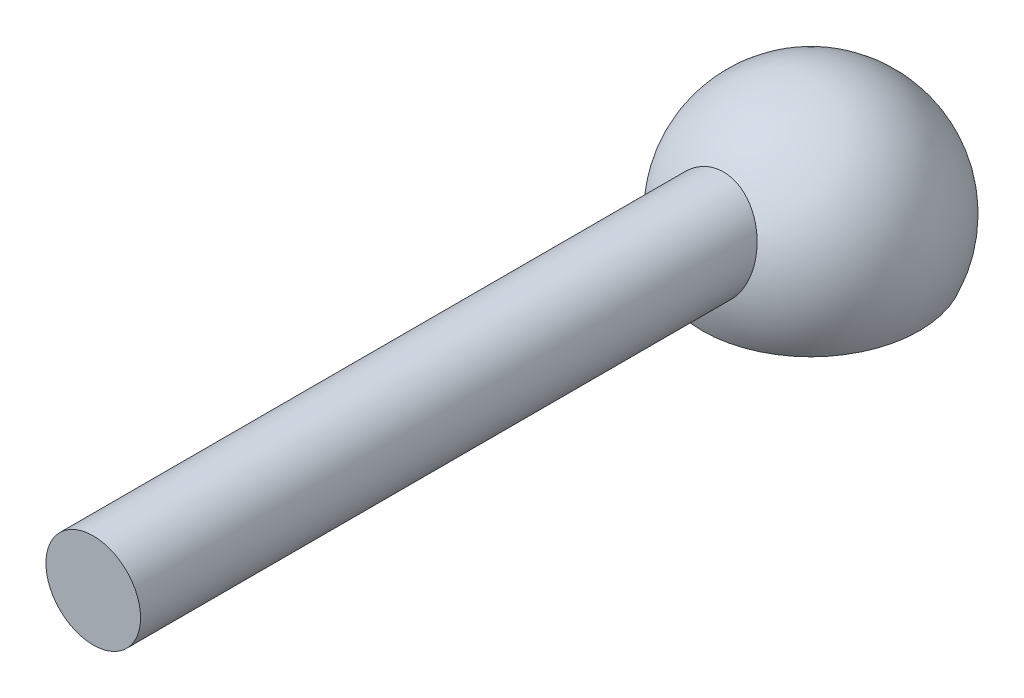
ISO-10303-21;
HEADER;
FILE_DESCRIPTION(('STEP AP214'),'2;1');
FILE_NAME('part.step','',(''),(''),'','','');
FILE_SCHEMA(('AUTOMOTIVE_DESIGN { 1 0 10303 214 1 1 1 1 }'));
ENDSEC;
DATA;
#1=APPLICATION_CONTEXT('core data for automotive mechanical design processes');
#2=APPLICATION_PROTOCOL_DEFINITION('international standard','automotive_design',2000,#1);
#3=PRODUCT_CONTEXT('',#1,'mechanical');
#4=PRODUCT('Part','Part','',(#3));
#5=PRODUCT_RELATED_PRODUCT_CATEGORY('part','',(#4));
#6=PRODUCT_DEFINITION_FORMATION('','',#4);
#7=PRODUCT_DEFINITION_CONTEXT('part definition',#1,'design');
#8=PRODUCT_DEFINITION('design','',#6,#7);
#9=PRODUCT_DEFINITION_SHAPE('','',#8);
#10=(LENGTH_UNIT() NAMED_UNIT(*) SI_UNIT(.MILLI.,.METRE.));
#11=(NAMED_UNIT(*) PLANE_ANGLE_UNIT() SI_UNIT($,.RADIAN.));
#12=(NAMED_UNIT(*) SI_UNIT($,.STERADIAN.) SOLID_ANGLE_UNIT());
#13=UNCERTAINTY_MEASURE_WITH_UNIT(LENGTH_MEASURE(1.E-05),#10,'distance_accuracy_value','');
#14=(GEOMETRIC_REPRESENTATION_CONTEXT(3) GLOBAL_UNCERTAINTY_ASSIGNED_CONTEXT((#13)) GLOBAL_UNIT_ASSIGNED_CONTEXT((#10,
#11,#12)) REPRESENTATION_CONTEXT('',''));
#15=CARTESIAN_POINT('',(0.,0.,0.));
#16=DIRECTION('',(0.,0.,1.));
#17=DIRECTION('',(1.,0.,0.));
#18=AXIS2_PLACEMENT_3D('',#15,#16,#17);
#19=CARTESIAN_POINT('',(37.3125835070615,6.,0.));
#20=DIRECTION('',(0.,1.,0.));
#21=DIRECTION('',(1.,0.,0.));
#22=AXIS2_PLACEMENT_3D('',#19,#20,#21);
#23=SPHERICAL_SURFACE('',#22,9.99999999999999);
#24=CARTESIAN_POINT('',(37.3125835070615,0.,0.));
#25=DIRECTION('',(0.,1.,0.));
#26=DIRECTION('',(0.,0.,1.));
#27=AXIS2_PLACEMENT_3D('',#24,#25,#26);
#28=CIRCLE('',#27,7.99999999999999);
#29=CARTESIAN_POINT('',(37.3125835070615,0.,7.99999999999999));
#30=VERTEX_POINT('',#29);
#31=EDGE_CURVE('E67',#30,#30,#28,.T.);
#32=ORIENTED_EDGE('',*,*,#31,.F.);
#33=EDGE_LOOP('',(#32));
#34=FACE_BOUND('',#33,.T.);
#35=CARTESIAN_POINT('',(39.1906681265482,15.822056715477,-0.000200000000000014));
#36=CARTESIAN_POINT('',(39.1906230974546,15.8220664757265,0.0446535123547709));
#37=CARTESIAN_POINT('',(39.1928766198065,15.8213289773038,0.0894635745935209));
#38=CARTESIAN_POINT('',(39.201642595824,15.8184312090794,0.1784987705083));
#39=CARTESIAN_POINT('',(39.208143297055,15.81627486527,0.222725175709271));
#40=CARTESIAN_POINT('',(39.2331615737999,15.8079020767784,0.352241360086195));
#41=CARTESIAN_POINT('',(39.2572259417548,15.7997749534268,0.436355595791474));
#42=CARTESIAN_POINT('',(39.3099033092538,15.781419650405,0.582508896572899));
#43=CARTESIAN_POINT('',(39.3364681770693,15.7720030147226,0.645445372399491));
#44=CARTESIAN_POINT('',(39.3944908936401,15.7508757363857,0.768653954140613));
#45=CARTESIAN_POINT('',(39.4259521103028,15.7391635132839,0.82892418918419));
#46=CARTESIAN_POINT('',(39.4927634330388,15.7135668387694,0.947792933402546));
#47=CARTESIAN_POINT('',(39.5281577863427,15.6996567299441,1.00636056037064));
#48=CARTESIAN_POINT('',(39.601440010752,15.6699793317295,1.12138524258195));
#49=CARTESIAN_POINT('',(39.6393271772049,15.6542125661815,1.17784288724599));
#50=CARTESIAN_POINT('',(39.7419392599826,15.6101896797294,1.32502842520843));
#51=CARTESIAN_POINT('',(39.8081545720566,15.58045794944,1.41427151258886));
#52=CARTESIAN_POINT('',(39.9430874857864,15.516713132872,1.58929491891902));
#53=CARTESIAN_POINT('',(40.0118063712368,15.4826978274393,1.67507341235454));
#54=CARTESIAN_POINT('',(40.1504787004132,15.4105751246969,1.84409705731475));
#55=CARTESIAN_POINT('',(40.2204338298428,15.3724617104362,1.92733824704162));
#56=CARTESIAN_POINT('',(40.3605749106433,15.2923448393309,2.0917345077868));
#57=CARTESIAN_POINT('',(40.4307608921926,15.2503408526718,2.1728892927523));
#58=CARTESIAN_POINT('',(40.6404200101803,15.1188271277259,2.41358361635266));
#59=CARTESIAN_POINT('',(40.7792446720571,15.0236871425457,2.57064871808993));
#60=CARTESIAN_POINT('',(41.0514698697103,14.8192813985914,2.87990707643909));
#61=CARTESIAN_POINT('',(41.1848744824165,14.7100265255835,3.03210397584051));
#62=CARTESIAN_POINT('',(41.454125366885,14.4689954981761,3.34441572630844));
#63=CARTESIAN_POINT('',(41.5893533438659,14.3361282557736,3.50422469994522));
#64=CARTESIAN_POINT('',(41.8485813505707,14.055641298096,3.82005114898483));
#65=CARTESIAN_POINT('',(41.9725788704273,13.9080183005243,3.97606777117235));
#66=CARTESIAN_POINT('',(42.2073718921931,13.5990106081316,4.28457154747255));
#67=CARTESIAN_POINT('',(42.3181613552347,13.4376196758739,4.43705706164657));
#68=CARTESIAN_POINT('',(42.524664525927,13.1023211930525,4.7384302177279));
#69=CARTESIAN_POINT('',(42.620378801738,12.928414114563,4.88731799504917));
#70=CARTESIAN_POINT('',(42.802507653559,12.5541298121632,5.19388757075186));
#71=CARTESIAN_POINT('',(42.8874412114426,12.3527589847484,5.3512417873534));
#72=CARTESIAN_POINT('',(43.0356549446197,11.9387264434693,5.66130483345647));
#73=CARTESIAN_POINT('',(43.0989328912142,11.7260635700779,5.8140131833535));
#74=CARTESIAN_POINT('',(43.2020003720419,11.2917147122663,6.11431629844855));
#75=CARTESIAN_POINT('',(43.2417981471291,11.0700319228082,6.26191284060152));
#76=CARTESIAN_POINT('',(43.2962992439098,10.6200446239578,6.55153737241449));
#77=CARTESIAN_POINT('',(43.3110066524723,10.3917411991368,6.69356626528353));
#78=CARTESIAN_POINT('',(43.3137606875655,9.95651823122967,6.95623308313413));
#79=CARTESIAN_POINT('',(43.304554135628,9.74999922757624,7.07750877382257));
#80=CARTESIAN_POINT('',(43.264307479107,9.336029850253,7.31472354815865));
#81=CARTESIAN_POINT('',(43.2332706576267,9.12857962129308,7.43066343147718));
#82=CARTESIAN_POINT('',(43.1487550784741,8.71516425821794,7.65664681497115));
#83=CARTESIAN_POINT('',(43.0952878911164,8.50919841404611,7.76669332218684));
#84=CARTESIAN_POINT('',(42.9655231467517,8.10117019348611,7.98038726680369));
#85=CARTESIAN_POINT('',(42.8892290365534,7.89910723267253,8.08403566745476));
#86=CARTESIAN_POINT('',(42.7247247205798,7.5264787703458,8.27178347033333));
#87=CARTESIAN_POINT('',(42.6392033250849,7.35513774894399,8.35670550739188));
#88=CARTESIAN_POINT('',(42.4507866769231,7.01938976942338,8.52076761247005));
#89=CARTESIAN_POINT('',(42.3478943315203,6.85498165673333,8.599908644849));
#90=CARTESIAN_POINT('',(42.1251845084437,6.53513664621503,8.7519271020705));
#91=CARTESIAN_POINT('',(42.0053782523397,6.37969389583908,8.8248086286449));
#92=CARTESIAN_POINT('',(41.749430965538,6.07965035942451,8.96391353164725));
#93=CARTESIAN_POINT('',(41.6132919629956,5.93504823084348,9.03013773289026));
#94=CARTESIAN_POINT('',(41.3426367512337,5.67501432348808,9.14806258705098));
#95=CARTESIAN_POINT('',(41.2098332804627,5.5581552949783,9.20055459535112));
#96=CARTESIAN_POINT('',(40.9330811914325,5.33571637318087,9.2997144104518));
#97=CARTESIAN_POINT('',(40.7891340281994,5.23013501164392,9.34638297554489));
#98=CARTESIAN_POINT('',(40.4911655350889,5.03154673245012,9.43359200844422));
#99=CARTESIAN_POINT('',(40.337149025433,4.93853386268278,9.47413537806504));
#100=CARTESIAN_POINT('',(40.0201736491554,4.76618864622254,9.54885315499242));
#101=CARTESIAN_POINT('',(39.8572154630719,4.68685526030212,9.58302804612688));
#102=CARTESIAN_POINT('',(39.5392700752824,4.54960869300935,9.64189538811669));
#103=CARTESIAN_POINT('',(39.3849540877833,4.49038866759011,9.66717455863374));
#104=CARTESIAN_POINT('',(39.0712297649009,4.38470231598818,9.71215085870743));
#105=CARTESIAN_POINT('',(38.9118218531629,4.33823493186237,9.73184845130918));
#106=CARTESIAN_POINT('',(38.5891808081287,4.25859336409192,9.76553577542518));
#107=CARTESIAN_POINT('',(38.425948877588,4.22541505855266,9.77952727683133));
#108=CARTESIAN_POINT('',(38.0969060779758,4.17271750428558,9.80172220947066));
#109=CARTESIAN_POINT('',(37.9310952824912,4.15319786654157,9.80992580555078));
#110=CARTESIAN_POINT('',(37.6074242437401,4.12873966569827,9.82020111817497));
#111=CARTESIAN_POINT('',(37.4496296747648,4.12305653019387,9.82258597046778));
#112=CARTESIAN_POINT('',(37.1340363746771,4.12414693053182,9.82212822469511));
#113=CARTESIAN_POINT('',(36.9762376594219,4.1309245835427,9.81928389885716));
#114=CARTESIAN_POINT('',(36.6619226049077,4.15686692743106,9.80838345656097));
#115=CARTESIAN_POINT('',(36.5054056777232,4.17602557506163,9.80032988277002));
#116=CARTESIAN_POINT('',(36.1946484478341,4.22653182086151,9.77905588603804));
#117=CARTESIAN_POINT('',(36.0404090098765,4.25788393124937,9.76583355037567));
#118=CARTESIAN_POINT('',(35.7372634794439,4.33198484776759,9.73449423758246));
#119=CARTESIAN_POINT('',(35.588314860316,4.3745866273539,9.71644036750145));
#120=CARTESIAN_POINT('',(35.2947051379133,4.47095150914896,9.67545758163242));
#121=CARTESIAN_POINT('',(35.1500455908493,4.52471860719972,9.65252692046822));
#122=CARTESIAN_POINT('',(34.8660463440678,4.64286314765722,9.60192279385231));
#123=CARTESIAN_POINT('',(34.7267049093458,4.70723709255907,9.57425089165936));
#124=CARTESIAN_POINT('',(34.4540898418083,4.84602670408118,9.51428736091477));
#125=CARTESIAN_POINT('',(34.3208185125432,4.92044614110427,9.48199399750187));
#126=CARTESIAN_POINT('',(34.0575005682923,5.0808615675557,9.41197697881226));
#127=CARTESIAN_POINT('',(33.9276505491764,5.1671246118691,9.37412597913123));
#128=CARTESIAN_POINT('',(33.6759109052525,5.34876588103842,9.29388072598853));
#129=CARTESIAN_POINT('',(33.5540241978506,5.44414741533274,9.25148482232991));
#130=CARTESIAN_POINT('',(33.3189062570158,5.64313557472865,9.16236257550585));
#131=CARTESIAN_POINT('',(33.2056732092479,5.74674046637534,9.11563714464378));
#132=CARTESIAN_POINT('',(32.9883103324273,5.96135467699995,9.01803145323914));
#133=CARTESIAN_POINT('',(32.8841839447148,6.07236676740587,8.96714963595593));
#134=CARTESIAN_POINT('',(32.6792810632971,6.30802197079657,8.85814025884441));
#135=CARTESIAN_POINT('',(32.5791198560036,6.43308339382077,8.79975864202489));
#136=CARTESIAN_POINT('',(32.3899418203289,6.68946903591247,8.67878551306934));
#137=CARTESIAN_POINT('',(32.3009291571837,6.82079557054976,8.61619244082698));
#138=CARTESIAN_POINT('',(32.0510843597149,7.22254817174418,8.4224656471122));
#139=CARTESIAN_POINT('',(31.907310474447,7.50090417515854,8.28531240054269));
#140=CARTESIAN_POINT('',(31.6558005735178,8.09523912761075,7.98427922944451));
#141=CARTESIAN_POINT('',(31.5523826568632,8.41236704646864,7.81910810610715));
#142=CARTESIAN_POINT('',(31.3999258082357,9.051893247954,7.47423138067091));
#143=CARTESIAN_POINT('',(31.3509068544508,9.37429342275474,7.29452046476692));
#144=CARTESIAN_POINT('',(31.3152345101285,9.87174179876929,7.00596987191421));
#145=CARTESIAN_POINT('',(31.3104934515549,10.0482022043766,6.90138134410098));
#146=CARTESIAN_POINT('',(31.3163374873073,10.3987579738638,6.68864423235293));
#147=CARTESIAN_POINT('',(31.3269232821444,10.5728532292779,6.58049548591974));
#148=CARTESIAN_POINT('',(31.3628111240285,10.9174391442339,6.36090316862071));
#149=CARTESIAN_POINT('',(31.3881163617266,11.0879290139501,6.24945888837332));
#150=CARTESIAN_POINT('',(31.4527419371086,11.4241680474747,6.02351481303277));
#151=CARTESIAN_POINT('',(31.4920633499419,11.5899168465521,5.90901478416348));
#152=CARTESIAN_POINT('',(31.5890639862469,11.9337221089364,5.6642911514055));
#153=CARTESIAN_POINT('',(31.6482962369284,12.111103067633,5.53373277351038));
#154=CARTESIAN_POINT('',(31.7819797647897,12.457419055925,5.26935321388252));
#155=CARTESIAN_POINT('',(31.8564281785794,12.6263556671515,5.13553265019737));
#156=CARTESIAN_POINT('',(32.0194237011682,12.9548386621501,4.86463658710411));
#157=CARTESIAN_POINT('',(32.1079841736655,13.1143759469065,4.72755810829886));
#158=CARTESIAN_POINT('',(32.2978548713744,13.4228539892755,4.45036549380329));
#159=CARTESIAN_POINT('',(32.3991651534441,13.5717946996277,4.31025134457761));
#160=CARTESIAN_POINT('',(32.6250788793025,13.8741335879133,4.01118011910974));
#161=CARTESIAN_POINT('',(32.7510199685738,14.0261782186175,3.85186351059497));
#162=CARTESIAN_POINT('',(33.0148221492208,14.3149242212551,3.52924301093224));
#163=CARTESIAN_POINT('',(33.1526841462274,14.451624425657,3.36593881752512));
#164=CARTESIAN_POINT('',(33.4374875534238,14.7083547709269,3.0351520759368));
#165=CARTESIAN_POINT('',(33.5844064846219,14.8284239587711,2.8676804426134));
#166=CARTESIAN_POINT('',(33.8843944029292,15.0512787308313,2.52700727898474));
#167=CARTESIAN_POINT('',(34.0374603906937,15.1540726202644,2.35380855022624));
#168=CARTESIAN_POINT('',(34.3077757121542,15.3187313262062,2.04183900647646));
#169=CARTESIAN_POINT('',(34.4247341446147,15.3844822524976,1.90487258472879));
#170=CARTESIAN_POINT('',(34.5981506506734,15.4748407142991,1.69366553810459));
#171=CARTESIAN_POINT('',(34.655738292622,15.5036340128714,1.62214706737318));
#172=CARTESIAN_POINT('',(34.7693274061749,15.558253636839,1.47678590434472));
#173=CARTESIAN_POINT('',(34.8253290711988,15.5840803252146,1.402943497805));
#174=CARTESIAN_POINT('',(34.9648682486873,15.645950583038,1.21081951983782));
#175=CARTESIAN_POINT('',(35.0466129970875,15.67980247854,1.09043047074753));
#176=CARTESIAN_POINT('',(35.1585276539768,15.7237146754194,0.902698025464321));
#177=CARTESIAN_POINT('',(35.1938906212763,15.7371548798199,0.839280471918938));
#178=CARTESIAN_POINT('',(35.259647968272,15.7615329914699,0.709489246182082));
#179=CARTESIAN_POINT('',(35.2900452868764,15.7724723803642,0.643117352328447));
#180=CARTESIAN_POINT('',(35.3525216274779,15.7945085247752,0.485023572413478));
#181=CARTESIAN_POINT('',(35.3819853128028,15.8045197383938,0.392025681388104));
#182=CARTESIAN_POINT('',(35.4127999602092,15.8148707670188,0.248249128149588));
#183=CARTESIAN_POINT('',(35.4208526390502,15.8175460012971,0.199064328422165));
#184=CARTESIAN_POINT('',(35.4317456445231,15.8211494600039,0.0998767975348133));
#185=CARTESIAN_POINT('',(35.4345660847707,15.822071019509,0.0498716715685352));
#186=CARTESIAN_POINT('',(35.4344988875747,15.822056715477,-0.000200000000019484));
#187=B_SPLINE_CURVE_WITH_KNOTS('',3,(#35,#36,#37,#38,#39,#40,#41,#42,#43,#44,#45,#46,#47,#48,
#49,#50,#51,#52,#53,#54,#55,#56,#57,#58,#59,#60,#61,#62,#63,#64,#65,#66,#67,#68,#69,#70,#71,#72,
#73,#74,#75,#76,#77,#78,#79,#80,#81,#82,#83,#84,#85,#86,#87,#88,#89,#90,#91,#92,#93,#94,#95,#96,
#97,#98,#99,#100,#101,#102,#103,#104,#105,#106,#107,#108,#109,#110,#111,#112,#113,#114,#115,
#116,#117,#118,#119,#120,#121,#122,#123,#124,#125,#126,#127,#128,#129,#130,#131,#132,#133,#134,
#135,#136,#137,#138,#139,#140,#141,#142,#143,#144,#145,#146,#147,#148,#149,#150,#151,#152,#153,
#154,#155,#156,#157,#158,#159,#160,#161,#162,#163,#164,#165,#166,#167,#168,#169,#170,#171,#172,
#173,#174,#175,#176,#177,#178,#179,#180,#181,#182,#183,#184,#185,#186),.UNSPECIFIED.,.F.,.F.,(4,
2,2,2,2,2,2,2,2,2,2,2,2,2,2,2,2,2,2,2,2,2,2,2,2,2,2,2,2,2,2,2,2,2,2,2,2,2,2,2,2,2,2,2,2,2,2,2,2,
2,2,2,2,2,2,2,2,2,2,2,2,2,2,2,2,2,2,2,2,2,2,2,2,2,2,4),(0.,0.13442227069509,0.268474145896687,
0.530716662759208,0.737323371614217,0.944072826208696,1.15344349753745,1.36275523748033,
1.70762095958882,2.05266608396675,2.39822491501076,2.74383087331805,3.43382134528137,
4.12328282042999,4.86641371569387,5.60971028375663,6.35334540226814,7.09695248762249,
7.90373732374841,8.71060516562227,9.51718965174438,10.3236427440089,11.0416580771424,
11.7595654494258,12.4771029561177,13.1945321710574,13.8221160786807,14.4495950555657,
15.0766596696766,15.7036464970759,16.2564717596489,16.8092249614689,17.3617154694167,
17.9141639862667,18.4151584424789,18.9161113242471,19.4169087041134,19.9176918200547,
20.3908649849258,20.8641945190172,21.3372931920979,21.8105671032488,22.2779379493227,
22.7454763471362,23.2128608860898,23.6804213401217,24.1611529003472,24.6420596031072,
25.1228652002826,25.6038517123073,26.1148756072807,26.6260898612488,27.6478681380128,
28.7601182334313,29.8727766711113,30.4877952090678,31.1028418572247,31.7180218753027,
32.3332490926222,33.0167530728292,33.7001285489218,34.384155049591,35.0681846008041,
35.8284569599107,36.5887871277048,37.3473007534434,38.1054486689119,38.6802362961664,
38.9688469296937,39.2574222124887,39.7046882847,39.9260088013259,40.147197851567,
40.4396731516822,40.5891201282625,40.7391339594807),.UNSPECIFIED.);
#188=CARTESIAN_POINT('',(39.1906681118318,15.8220567203272,0.));
#189=VERTEX_POINT('',#188);
#190=CARTESIAN_POINT('',(35.4344989022911,15.8220567203272,0.));
#191=VERTEX_POINT('',#190);
#192=EDGE_CURVE('E62',#189,#191,#187,.T.);
#193=ORIENTED_EDGE('',*,*,#192,.F.);
#194=CARTESIAN_POINT('',(37.3125835070615,6.,0.));
#195=DIRECTION('',(0.,0.,1.));
#196=DIRECTION('',(1.,0.,0.));
#197=AXIS2_PLACEMENT_3D('',#194,#195,#196);
#198=CIRCLE('',#197,9.99999999999999);
#199=EDGE_CURVE('E11',#191,#189,#198,.F.);
#200=ORIENTED_EDGE('',*,*,#199,.F.);
#201=EDGE_LOOP('',(#193,#200));
#202=FACE_BOUND('',#201,.T.);
#203=ADVANCED_FACE('F47',(#34,#202),#23,.F.);
#204=CARTESIAN_POINT('',(37.3125835070615,6.,0.));
#205=DIRECTION('',(0.,1.,0.));
#206=DIRECTION('',(1.,0.,0.));
#207=AXIS2_PLACEMENT_3D('',#204,#205,#206);
#208=SPHERICAL_SURFACE('',#207,15.);
#209=CARTESIAN_POINT('',(37.3125835070615,0.,0.));
#210=DIRECTION('',(0.,1.,0.));
#211=DIRECTION('',(0.,0.,1.));
#212=AXIS2_PLACEMENT_3D('',#209,#210,#211);
#213=CIRCLE('',#212,13.7477270848675);
#214=CARTESIAN_POINT('',(37.3125835070615,0.,13.7477270848675));
#215=VERTEX_POINT('',#214);
#216=EDGE_CURVE('E56',#215,#215,#213,.T.);
#217=ORIENTED_EDGE('',*,*,#216,.T.);
#218=EDGE_LOOP('',(#217));
#219=FACE_BOUND('',#218,.T.);
#220=CARTESIAN_POINT('',(32.1890292102156,7.00119633676128,14.0622472337293));
#221=CARTESIAN_POINT('',(32.0976613253458,7.15112324989464,14.0182831686085));
#222=CARTESIAN_POINT('',(32.0130508909223,7.30477940298967,13.9730191076389));
#223=CARTESIAN_POINT('',(31.8577952157429,7.61838931280699,13.8801614375931));
#224=CARTESIAN_POINT('',(31.7871550866948,7.7783453490683,13.832566983748));
#225=CARTESIAN_POINT('',(31.6601740087335,8.1034754177053,13.7353021224021));
#226=CARTESIAN_POINT('',(31.6038515447199,8.26865588902787,13.6856291267249));
#227=CARTESIAN_POINT('',(31.5058793695093,8.60286750197007,13.5845558981022));
#228=CARTESIAN_POINT('',(31.4642352978448,8.77190009710332,13.533155009579));
#229=CARTESIAN_POINT('',(31.3959042925167,9.11215524368773,13.4290782552268));
#230=CARTESIAN_POINT('',(31.3691849467871,9.2833722170472,13.3764054134722));
#231=CARTESIAN_POINT('',(31.3306463636214,9.62720856006739,13.2699872445791));
#232=CARTESIAN_POINT('',(31.3188325753785,9.79982841939973,13.2162415325091));
#233=CARTESIAN_POINT('',(31.3101399829208,10.1451135894677,13.10806691249));
#234=CARTESIAN_POINT('',(31.3132511940799,10.3177787925679,13.0536384855728));
#235=CARTESIAN_POINT('',(31.3343088432202,10.6621087561043,12.9444104943083));
#236=CARTESIAN_POINT('',(31.352260902279,10.8337731126493,12.8896107971409));
#237=CARTESIAN_POINT('',(31.4292717737036,11.3525201551761,12.722944091607));
#238=CARTESIAN_POINT('',(31.5116641006529,11.6963928052394,12.610989950132));
#239=CARTESIAN_POINT('',(31.7359519288025,12.3653599199813,12.3903191133975));
#240=CARTESIAN_POINT('',(31.8778561782741,12.6904516158567,12.2816028966314));
#241=CARTESIAN_POINT('',(32.132647002123,13.1566783398322,12.1237176981634));
#242=CARTESIAN_POINT('',(32.2246545224345,13.308628921967,12.0719157780572));
#243=CARTESIAN_POINT('',(32.4221445262538,13.6042490033227,11.9705101556552));
#244=CARTESIAN_POINT('',(32.5276213795927,13.7479219263903,11.920905546488));
#245=CARTESIAN_POINT('',(32.7514692260461,14.0258860474529,11.8243642524768));
#246=CARTESIAN_POINT('',(32.8698445836225,14.1601740444884,11.7774284789123));
#247=CARTESIAN_POINT('',(33.1186743969712,14.4181226823729,11.6867652723942));
#248=CARTESIAN_POINT('',(33.2491233368072,14.5417881269372,11.6430363905471));
#249=CARTESIAN_POINT('',(33.516721108428,14.7734792651195,11.5606831825031));
#250=CARTESIAN_POINT('',(33.6534988477603,14.8818902257577,11.5219368932685));
#251=CARTESIAN_POINT('',(33.9366280932658,15.0867748469487,11.4483762671304));
#252=CARTESIAN_POINT('',(34.0829754001534,15.1832536904833,11.4135602236142));
#253=CARTESIAN_POINT('',(34.3842667057196,15.3633906561989,11.348292607432));
#254=CARTESIAN_POINT('',(34.5392098317066,15.4470500766405,11.3178405928283));
#255=CARTESIAN_POINT('',(34.8565604058563,15.6007024057566,11.2617195163798));
#256=CARTESIAN_POINT('',(35.0189674490837,15.6706960547528,11.2360501954436));
#257=CARTESIAN_POINT('',(35.3403645592541,15.7926184487523,11.1912132808906));
#258=CARTESIAN_POINT('',(35.4990062436891,15.8453596477338,11.1717548861791));
#259=CARTESIAN_POINT('',(35.820619322131,15.9375163135034,11.1376873848949));
#260=CARTESIAN_POINT('',(35.9835904605992,15.9769325648974,11.123077992802));
#261=CARTESIAN_POINT('',(36.3125785202032,16.0420200684871,11.098922448757));
#262=CARTESIAN_POINT('',(36.4785945908885,16.0676950999213,11.0893749046551));
#263=CARTESIAN_POINT('',(36.8124096673061,16.1050397154359,11.0754797037764));
#264=CARTESIAN_POINT('',(36.9802086187296,16.1167097249012,11.0711318890643));
#265=CARTESIAN_POINT('',(37.3080355406926,16.1256939561004,11.0677850502387));
#266=CARTESIAN_POINT('',(37.4680429390868,16.1236812449209,11.06853524889));
#267=CARTESIAN_POINT('',(37.7873479947207,16.1068897667574,11.0747891257061));
#268=CARTESIAN_POINT('',(37.9466453989416,16.0921067656052,11.0802943804761));
#269=CARTESIAN_POINT('',(38.2632534644391,16.0499240467994,11.0959816757592));
#270=CARTESIAN_POINT('',(38.4205649713715,16.0225298992937,11.1061616515157));
#271=CARTESIAN_POINT('',(38.7322200309212,15.9553795769232,11.1310656998002));
#272=CARTESIAN_POINT('',(38.8865624531369,15.9156187889616,11.1457914680184));
#273=CARTESIAN_POINT('',(39.1900985763478,15.8244320441287,11.1794763556973));
#274=CARTESIAN_POINT('',(39.3393206472391,15.7730892493057,11.1984052808403));
#275=CARTESIAN_POINT('',(39.6328190631577,15.6590247175843,11.2403285328785));
#276=CARTESIAN_POINT('',(39.7770936116937,15.5962988983485,11.2633243182116));
#277=CARTESIAN_POINT('',(40.0597107745766,15.4600342446096,11.3131015071522));
#278=CARTESIAN_POINT('',(40.1980549514531,15.3864982812547,11.3398819055028));
#279=CARTESIAN_POINT('',(40.4680891780179,15.2291721505621,11.3969474661439));
#280=CARTESIAN_POINT('',(40.5997766908377,15.1453781148639,11.4272339503581));
#281=CARTESIAN_POINT('',(40.8604950444069,14.9648857563286,11.4921840196406));
#282=CARTESIAN_POINT('',(40.9892436928005,14.8678227477873,11.5269687134254));
#283=CARTESIAN_POINT('',(41.2380349111281,14.6641298630033,11.5996077098825));
#284=CARTESIAN_POINT('',(41.3580742625481,14.5574964822742,11.6374631365062));
#285=CARTESIAN_POINT('',(41.7040772024376,14.2244290032795,11.7550824003436));
#286=CARTESIAN_POINT('',(41.9161248164111,13.9846888773423,11.8389493813059));
#287=CARTESIAN_POINT('',(42.3092337490291,13.4622115886284,12.0195912667011));
#288=CARTESIAN_POINT('',(42.4878407209636,13.1778027419149,12.1168293894861));
#289=CARTESIAN_POINT('',(42.7947799086455,12.5846423964935,12.3170361701327));
#290=CARTESIAN_POINT('',(42.9230996655101,12.2758848880272,12.4200062409026));
#291=CARTESIAN_POINT('',(43.0781287540563,11.7935670959403,12.5788112196282));
#292=CARTESIAN_POINT('',(43.1241247903166,11.6256538026153,12.633737866652));
#293=CARTESIAN_POINT('',(43.2013491616766,11.2865890716458,12.7439250093747));
#294=CARTESIAN_POINT('',(43.2325823625351,11.1154387202899,12.7991853889866));
#295=CARTESIAN_POINT('',(43.2800873405003,10.7709854585304,12.9096826693892));
#296=CARTESIAN_POINT('',(43.2963518481373,10.5976815436216,12.964919545764));
#297=CARTESIAN_POINT('',(43.3137659747478,10.2502447260258,13.0749566991097));
#298=CARTESIAN_POINT('',(43.3149211225603,10.0761121498981,13.1297571284497));
#299=CARTESIAN_POINT('',(43.3019589975548,9.72512040578605,13.239535572862));
#300=CARTESIAN_POINT('',(43.2875744879603,9.54826676611794,13.2944999567031));
#301=CARTESIAN_POINT('',(43.2431426277883,9.19624163044574,13.4032430803849));
#302=CARTESIAN_POINT('',(43.2131011612048,9.02106952767689,13.4570222577266));
#303=CARTESIAN_POINT('',(43.1374577074627,8.67357595717667,13.5630850470423));
#304=CARTESIAN_POINT('',(43.0918497159345,8.50125561636788,13.6153680734694));
#305=CARTESIAN_POINT('',(42.9853091048174,8.16092368645382,13.7180541019413));
#306=CARTESIAN_POINT('',(42.9243828240795,7.99291034668407,13.7684578717575));
#307=CARTESIAN_POINT('',(42.7884738669532,7.66476126245974,13.8663857637742));
#308=CARTESIAN_POINT('',(42.7136999949132,7.50454814754111,13.9139403287257));
#309=CARTESIAN_POINT('',(42.5500016896627,7.19086488996274,14.0065956373591));
#310=CARTESIAN_POINT('',(42.4610832037462,7.03739194776208,14.0516974017064));
#311=CARTESIAN_POINT('',(42.2695752499187,6.7383378323366,14.1391845730772));
#312=CARTESIAN_POINT('',(42.1669819435487,6.59275889112149,14.1815692124513));
#313=CARTESIAN_POINT('',(41.9488405182576,6.31084101361177,14.2633067127261));
#314=CARTESIAN_POINT('',(41.8332981005608,6.1744980529999,14.3026608950984));
#315=CARTESIAN_POINT('',(41.5942388964073,5.91675715476513,14.376774167018));
#316=CARTESIAN_POINT('',(41.4711394689754,5.79500427284177,14.4116454975564));
#317=CARTESIAN_POINT('',(41.2144307022061,5.56225110578951,14.478089362909));
#318=CARTESIAN_POINT('',(41.0808257937257,5.45124633108546,14.5096632755194));
#319=CARTESIAN_POINT('',(40.8039856699129,5.24090956949915,14.5693172134571));
#320=CARTESIAN_POINT('',(40.6607502594991,5.14157781918516,14.5973971679757));
#321=CARTESIAN_POINT('',(40.3656888177202,4.95549397759519,14.6498690329758));
#322=CARTESIAN_POINT('',(40.213863043813,4.86874150958886,14.6742610539062));
#323=CARTESIAN_POINT('',(39.9089793831569,4.71182496357689,14.7182882719704));
#324=CARTESIAN_POINT('',(39.7562128520671,4.64113676779113,14.7380745363269));
#325=CARTESIAN_POINT('',(39.4448486922617,4.5127001411623,14.7739661405438));
#326=CARTESIAN_POINT('',(39.2862490584265,4.4549562092086,14.7900702006615));
#327=CARTESIAN_POINT('',(38.9645211973755,4.35298840367979,14.8184722076822));
#328=CARTESIAN_POINT('',(38.8013953920263,4.30875744615207,14.8307721488734));
#329=CARTESIAN_POINT('',(38.4716960066833,4.23416575730274,14.8514972469167));
#330=CARTESIAN_POINT('',(38.305121204265,4.20381003487501,14.8599210044924));
#331=CARTESIAN_POINT('',(37.9748293723928,4.15796443354549,14.8726374369019));
#332=CARTESIAN_POINT('',(37.811174137691,4.14206030493225,14.8770452383653));
#333=CARTESIAN_POINT('',(37.483050020268,4.12373747039654,14.88212303447));
#334=CARTESIAN_POINT('',(37.3185811328825,4.12131884186897,14.8827930076596));
#335=CARTESIAN_POINT('',(36.9900501140704,4.12998836855306,14.8803907514384));
#336=CARTESIAN_POINT('',(36.8259879305511,4.14107469375615,14.8773190290516));
#337=CARTESIAN_POINT('',(36.4994366940101,4.17665342531609,14.8674543524622));
#338=CARTESIAN_POINT('',(36.336947641837,4.2011458389049,14.8606613962521));
#339=CARTESIAN_POINT('',(36.0163572389357,4.2630046889653,14.8434866936902));
#340=CARTESIAN_POINT('',(35.8582280453366,4.3002373409536,14.8331422377911));
#341=CARTESIAN_POINT('',(35.5457601515096,4.38730928428455,14.8089167270224));
#342=CARTESIAN_POINT('',(35.3914214059757,4.43714842486515,14.7950357144466));
#343=CARTESIAN_POINT('',(35.0875211001059,4.54904093419622,14.763816898544));
#344=CARTESIAN_POINT('',(34.937961687837,4.61109970774708,14.746477565542));
#345=CARTESIAN_POINT('',(34.6447420635733,4.7468830670202,14.7084593590444));
#346=CARTESIAN_POINT('',(34.5010798866484,4.8206037266628,14.6877816094089));
#347=CARTESIAN_POINT('',(34.2188022147562,4.98011164472146,14.6429320068275));
#348=CARTESIAN_POINT('',(34.0802708921576,5.06603660304214,14.6187201783944));
#349=CARTESIAN_POINT('',(33.8110950751501,5.24852626875014,14.5671535476685));
#350=CARTESIAN_POINT('',(33.6804479963522,5.34508746002425,14.5397997839057));
#351=CARTESIAN_POINT('',(33.4279081715339,5.54803147634118,14.4821293221139));
#352=CARTESIAN_POINT('',(33.3060080613716,5.65440586292133,14.4518151684626));
#353=CARTESIAN_POINT('',(33.0715997606732,5.87620316871368,14.3883900924787));
#354=CARTESIAN_POINT('',(32.9590891288655,5.99162372068685,14.3552799016506));
#355=CARTESIAN_POINT('',(32.7272303833975,6.24940809259274,14.2810531002961));
#356=CARTESIAN_POINT('',(32.6095649992563,6.39316254419148,14.2394941922532));
#357=CARTESIAN_POINT('',(32.3884572110639,6.69030508133395,14.1531841039347));
#358=CARTESIAN_POINT('',(32.2850143692628,6.84369287016531,14.1084330219742));
#359=CARTESIAN_POINT('',(32.1890292102156,7.00119633676128,14.0622472337293));
#360=B_SPLINE_CURVE_WITH_KNOTS('',3,(#220,#221,#222,#223,#224,#225,#226,#227,#228,#229,#230,
#231,#232,#233,#234,#235,#236,#237,#238,#239,#240,#241,#242,#243,#244,#245,#246,#247,#248,#249,
#250,#251,#252,#253,#254,#255,#256,#257,#258,#259,#260,#261,#262,#263,#264,#265,#266,#267,#268,
#269,#270,#271,#272,#273,#274,#275,#276,#277,#278,#279,#280,#281,#282,#283,#284,#285,#286,#287,
#288,#289,#290,#291,#292,#293,#294,#295,#296,#297,#298,#299,#300,#301,#302,#303,#304,#305,#306,
#307,#308,#309,#310,#311,#312,#313,#314,#315,#316,#317,#318,#319,#320,#321,#322,#323,#324,#325,
#326,#327,#328,#329,#330,#331,#332,#333,#334,#335,#336,#337,#338,#339,#340,#341,#342,#343,#344,
#345,#346,#347,#348,#349,#350,#351,#352,#353,#354,#355,#356,#357,#358,#359),.UNSPECIFIED.,.T.,
.F.,(4,2,2,2,2,2,2,2,2,2,2,2,2,2,2,2,2,2,2,2,2,2,2,2,2,2,2,2,2,2,2,2,2,2,2,2,2,2,2,2,2,2,2,2,2,
2,2,2,2,2,2,2,2,2,2,2,2,2,2,2,2,2,2,2,2,2,2,2,2,4),(0.,0.542807677898556,1.08581360210158,
1.62951705681318,2.17342917875784,2.71615544658412,3.25908006755495,3.80164152984821,
4.34440858539179,5.45157248120987,6.55889918754684,7.11342827590602,7.6677263257236,
8.22221251903727,8.77644662861544,9.31210493173252,9.84752973633408,10.3829002809978,
10.9182418147475,11.4225255625469,11.9267796116958,12.4308949048295,12.9349948857097,
13.4144834948289,13.8941311461464,14.3735671474926,14.8531822065769,15.3294573236778,
15.8059035879152,16.2822235370364,16.7587236648656,17.2529927788089,17.7474436288661,
18.7356103850353,19.7800880482407,20.8248243221146,21.3719778327389,21.9189508782492,
22.4661894184735,23.0132277067667,23.5698254345592,24.1262141397009,24.6828176998606,
25.2391913102723,25.7877731043388,26.3361248465047,26.8846308338871,27.4328962672427,
27.9620846480437,28.4910510200643,29.0200281103951,29.5489893553948,30.0568257867875,
30.5648384483478,31.0725843339009,31.5805133688232,32.0733759380498,32.5662413358705,
33.0590399546706,33.5518388393127,34.0396140768395,34.527383481297,35.01536911502,
35.5031908122222,35.9970333685504,36.4907131581872,36.983972316005,37.4771028238971,
38.0473588322106,38.6175972849152),.UNSPECIFIED.);
#361=CARTESIAN_POINT('',(32.1890292102156,7.00119633676128,14.0622472337293));
#362=VERTEX_POINT('',#361);
#363=EDGE_CURVE('E68',#362,#362,#360,.T.);
#364=ORIENTED_EDGE('',*,*,#363,.T.);
#365=EDGE_LOOP('',(#364));
#366=FACE_BOUND('',#365,.T.);
#367=ADVANCED_FACE('F102',(#219,#366),#208,.T.);
#368=CARTESIAN_POINT('',(0.,0.,0.));
#369=DIRECTION('',(0.,-1.,0.));
#370=DIRECTION('',(0.,0.,-1.));
#371=AXIS2_PLACEMENT_3D('',#368,#369,#370);
#372=PLANE('',#371);
#373=ORIENTED_EDGE('',*,*,#31,.T.);
#374=EDGE_LOOP('',(#373));
#375=FACE_BOUND('',#374,.T.);
#376=ORIENTED_EDGE('',*,*,#216,.F.);
#377=EDGE_LOOP('',(#376));
#378=FACE_BOUND('',#377,.T.);
#379=ADVANCED_FACE('F95',(#375,#378),#372,.T.);
#380=CARTESIAN_POINT('',(37.3125835070615,10.1235658484099,91.));
#381=DIRECTION('',(0.,0.,1.));
#382=DIRECTION('',(1.,0.,0.));
#383=AXIS2_PLACEMENT_3D('',#380,#381,#382);
#384=PLANE('',#383);
#385=CARTESIAN_POINT('',(37.3125835070615,10.1235658484099,91.));
#386=DIRECTION('',(0.,0.,1.));
#387=DIRECTION('',(1.,0.,0.));
#388=AXIS2_PLACEMENT_3D('',#385,#386,#387);
#389=CIRCLE('',#388,6.);
#390=CARTESIAN_POINT('',(43.3125835070615,10.1235658484099,91.));
#391=VERTEX_POINT('',#390);
#392=EDGE_CURVE('E75',#391,#391,#389,.T.);
#393=ORIENTED_EDGE('',*,*,#392,.T.);
#394=EDGE_LOOP('',(#393));
#395=FACE_BOUND('',#394,.T.);
#396=ADVANCED_FACE('F92',(#395),#384,.T.);
#397=CARTESIAN_POINT('',(37.3125835070615,10.1235658484099,91.));
#398=DIRECTION('',(0.,0.,-1.));
#399=DIRECTION('',(-1.,0.,0.));
#400=AXIS2_PLACEMENT_3D('',#397,#398,#399);
#401=CYLINDRICAL_SURFACE('',#400,6.);
#402=ORIENTED_EDGE('',*,*,#363,.F.);
#403=EDGE_LOOP('',(#402));
#404=FACE_BOUND('',#403,.T.);
#405=ORIENTED_EDGE('',*,*,#392,.F.);
#406=EDGE_LOOP('',(#405));
#407=FACE_BOUND('',#406,.T.);
#408=ADVANCED_FACE('F87',(#404,#407),#401,.T.);
#409=CARTESIAN_POINT('',(37.3125835070615,10.1235658484099,0.));
#410=DIRECTION('',(0.,0.,1.));
#411=DIRECTION('',(1.,0.,0.));
#412=AXIS2_PLACEMENT_3D('',#409,#410,#411);
#413=PLANE('',#412);
#414=CARTESIAN_POINT('',(37.3125835070615,10.1235658484099,0.));
#415=DIRECTION('',(0.,0.,1.));
#416=DIRECTION('',(1.,0.,0.));
#417=AXIS2_PLACEMENT_3D('',#414,#415,#416);
#418=CIRCLE('',#417,6.);
#419=EDGE_CURVE('E72',#191,#189,#418,.T.);
#420=ORIENTED_EDGE('',*,*,#419,.F.);
#421=ORIENTED_EDGE('',*,*,#199,.T.);
#422=EDGE_LOOP('',(#420,#421));
#423=FACE_BOUND('',#422,.T.);
#424=ADVANCED_FACE('F71',(#423),#413,.F.);
#425=ORIENTED_EDGE('',*,*,#419,.T.);
#426=ORIENTED_EDGE('',*,*,#192,.T.);
#427=EDGE_LOOP('',(#425,#426));
#428=FACE_BOUND('',#427,.T.);
#429=ADVANCED_FACE('F73',(#428),#401,.T.);
#430=CLOSED_SHELL('',(#203,#367,#379,#396,#408,#424,#429));
#431=MANIFOLD_SOLID_BREP('B2',#430);
#432=ADVANCED_BREP_SHAPE_REPRESENTATION('',(#18,#431),#14);
#433=SHAPE_DEFINITION_REPRESENTATION(#9,#432);
ENDSEC;
END-ISO-10303-21;
